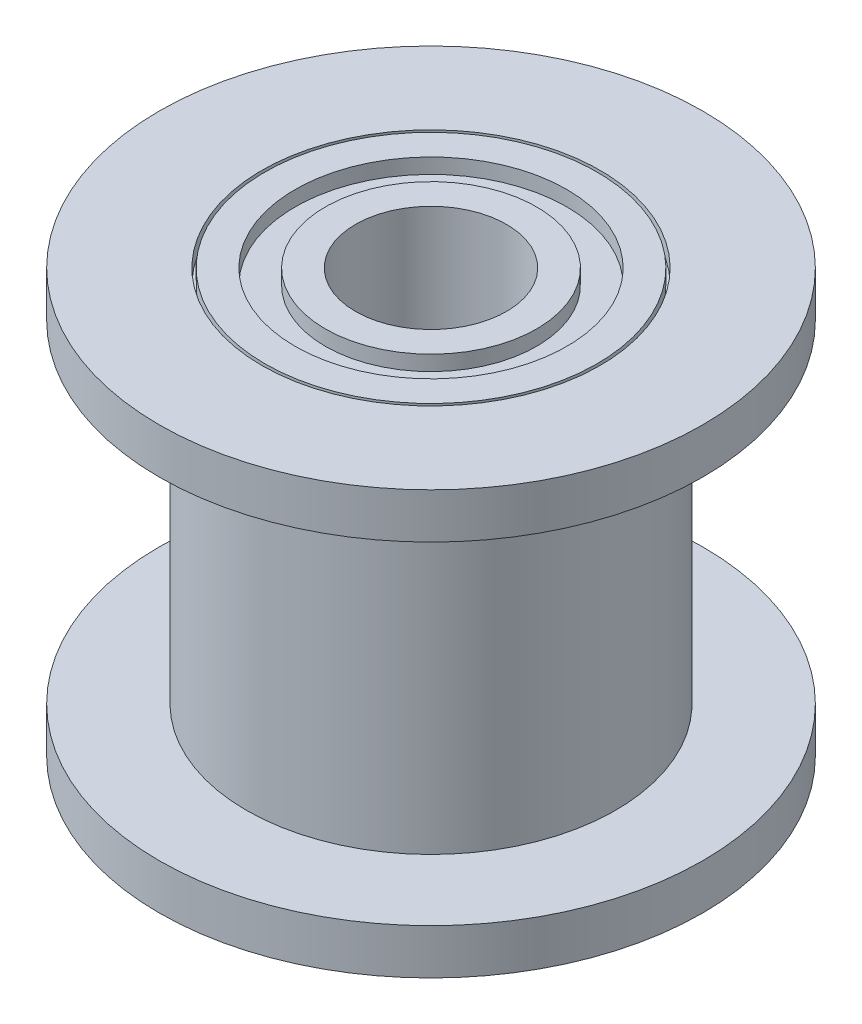
ISO-10303-21;
HEADER;
FILE_DESCRIPTION(('STEP AP214'),'2;1');
FILE_NAME('part.step','',(''),(''),'','','');
FILE_SCHEMA(('AUTOMOTIVE_DESIGN { 1 0 10303 214 1 1 1 1 }'));
ENDSEC;
DATA;
#1=APPLICATION_CONTEXT('core data for automotive mechanical design processes');
#2=APPLICATION_PROTOCOL_DEFINITION('international standard','automotive_design',2000,#1);
#3=PRODUCT_CONTEXT('',#1,'mechanical');
#4=PRODUCT('Part','Part','',(#3));
#5=PRODUCT_RELATED_PRODUCT_CATEGORY('part','',(#4));
#6=PRODUCT_DEFINITION_FORMATION('','',#4);
#7=PRODUCT_DEFINITION_CONTEXT('part definition',#1,'design');
#8=PRODUCT_DEFINITION('design','',#6,#7);
#9=PRODUCT_DEFINITION_SHAPE('','',#8);
#10=(LENGTH_UNIT() NAMED_UNIT(*) SI_UNIT(.MILLI.,.METRE.));
#11=(NAMED_UNIT(*) PLANE_ANGLE_UNIT() SI_UNIT($,.RADIAN.));
#12=(NAMED_UNIT(*) SI_UNIT($,.STERADIAN.) SOLID_ANGLE_UNIT());
#13=UNCERTAINTY_MEASURE_WITH_UNIT(LENGTH_MEASURE(1.E-05),#10,'distance_accuracy_value','');
#14=(GEOMETRIC_REPRESENTATION_CONTEXT(3) GLOBAL_UNCERTAINTY_ASSIGNED_CONTEXT((#13)) GLOBAL_UNIT_ASSIGNED_CONTEXT((#10,
#11,#12)) REPRESENTATION_CONTEXT('',''));
#15=CARTESIAN_POINT('',(0.,0.,0.));
#16=DIRECTION('',(0.,0.,1.));
#17=DIRECTION('',(1.,0.,0.));
#18=AXIS2_PLACEMENT_3D('',#15,#16,#17);
#19=CARTESIAN_POINT('',(0.,0.,0.));
#20=DIRECTION('',(0.,1.,0.));
#21=DIRECTION('',(0.,0.,1.));
#22=AXIS2_PLACEMENT_3D('',#19,#20,#21);
#23=PLANE('',#22);
#24=CARTESIAN_POINT('',(0.,0.,0.));
#25=DIRECTION('',(0.,1.,0.));
#26=DIRECTION('',(0.,0.,1.));
#27=AXIS2_PLACEMENT_3D('',#24,#25,#26);
#28=CIRCLE('',#27,2.5);
#29=CARTESIAN_POINT('',(0.,0.,2.5));
#30=VERTEX_POINT('',#29);
#31=EDGE_CURVE('E86',#30,#30,#28,.T.);
#32=ORIENTED_EDGE('',*,*,#31,.T.);
#33=EDGE_LOOP('',(#32));
#34=FACE_BOUND('',#33,.T.);
#35=CARTESIAN_POINT('',(0.,0.,0.));
#36=DIRECTION('',(0.,1.,0.));
#37=DIRECTION('',(0.,0.,1.));
#38=AXIS2_PLACEMENT_3D('',#35,#36,#37);
#39=CIRCLE('',#38,3.5);
#40=CARTESIAN_POINT('',(0.,0.,3.5));
#41=VERTEX_POINT('',#40);
#42=EDGE_CURVE('E135',#41,#41,#39,.T.);
#43=ORIENTED_EDGE('',*,*,#42,.F.);
#44=EDGE_LOOP('',(#43));
#45=FACE_BOUND('',#44,.T.);
#46=ADVANCED_FACE('F61',(#34,#45),#23,.F.);
#47=CARTESIAN_POINT('',(0.,14.,0.));
#48=DIRECTION('',(0.,-1.,0.));
#49=DIRECTION('',(0.,0.,1.));
#50=AXIS2_PLACEMENT_3D('',#47,#48,#49);
#51=PLANE('',#50);
#52=CARTESIAN_POINT('',(0.,14.,0.));
#53=DIRECTION('',(0.,1.,0.));
#54=DIRECTION('',(0.,0.,1.));
#55=AXIS2_PLACEMENT_3D('',#52,#53,#54);
#56=CIRCLE('',#55,2.5);
#57=CARTESIAN_POINT('',(0.,14.,2.5));
#58=VERTEX_POINT('',#57);
#59=EDGE_CURVE('E90',#58,#58,#56,.T.);
#60=ORIENTED_EDGE('',*,*,#59,.F.);
#61=EDGE_LOOP('',(#60));
#62=FACE_BOUND('',#61,.T.);
#63=CARTESIAN_POINT('',(0.,14.,0.));
#64=DIRECTION('',(0.,1.,0.));
#65=DIRECTION('',(0.,0.,1.));
#66=AXIS2_PLACEMENT_3D('',#63,#64,#65);
#67=CIRCLE('',#66,3.5);
#68=CARTESIAN_POINT('',(0.,14.,3.5));
#69=VERTEX_POINT('',#68);
#70=EDGE_CURVE('E103',#69,#69,#67,.T.);
#71=ORIENTED_EDGE('',*,*,#70,.T.);
#72=EDGE_LOOP('',(#71));
#73=FACE_BOUND('',#72,.T.);
#74=ADVANCED_FACE('F184',(#62,#73),#51,.F.);
#75=CARTESIAN_POINT('',(0.,1.5,0.));
#76=DIRECTION('',(0.,-1.,0.));
#77=DIRECTION('',(0.,0.,-1.));
#78=AXIS2_PLACEMENT_3D('',#75,#76,#77);
#79=CYLINDRICAL_SURFACE('',#78,9.);
#80=CARTESIAN_POINT('',(0.,1.5,0.));
#81=DIRECTION('',(0.,1.,0.));
#82=DIRECTION('',(0.,0.,1.));
#83=AXIS2_PLACEMENT_3D('',#80,#81,#82);
#84=CIRCLE('',#83,9.);
#85=CARTESIAN_POINT('',(0.,1.5,9.));
#86=VERTEX_POINT('',#85);
#87=EDGE_CURVE('E70',#86,#86,#84,.T.);
#88=ORIENTED_EDGE('',*,*,#87,.F.);
#89=EDGE_LOOP('',(#88));
#90=FACE_BOUND('',#89,.T.);
#91=CARTESIAN_POINT('',(0.,0.,0.));
#92=DIRECTION('',(0.,1.,0.));
#93=DIRECTION('',(0.,0.,1.));
#94=AXIS2_PLACEMENT_3D('',#91,#92,#93);
#95=CIRCLE('',#94,9.);
#96=CARTESIAN_POINT('',(0.,0.,9.));
#97=VERTEX_POINT('',#96);
#98=EDGE_CURVE('E65',#97,#97,#95,.T.);
#99=ORIENTED_EDGE('',*,*,#98,.T.);
#100=EDGE_LOOP('',(#99));
#101=FACE_BOUND('',#100,.T.);
#102=ADVANCED_FACE('F63',(#90,#101),#79,.T.);
#103=CARTESIAN_POINT('',(0.,1.5,0.));
#104=DIRECTION('',(0.,1.,0.));
#105=DIRECTION('',(0.,0.,1.));
#106=AXIS2_PLACEMENT_3D('',#103,#104,#105);
#107=PLANE('',#106);
#108=CARTESIAN_POINT('',(0.,1.5,0.));
#109=DIRECTION('',(0.,1.,0.));
#110=DIRECTION('',(0.,0.,1.));
#111=AXIS2_PLACEMENT_3D('',#108,#109,#110);
#112=CIRCLE('',#111,6.1121977);
#113=CARTESIAN_POINT('',(0.,1.5,6.1121977));
#114=VERTEX_POINT('',#113);
#115=EDGE_CURVE('E11',#114,#114,#112,.T.);
#116=ORIENTED_EDGE('',*,*,#115,.F.);
#117=EDGE_LOOP('',(#116));
#118=FACE_BOUND('',#117,.T.);
#119=ORIENTED_EDGE('',*,*,#87,.T.);
#120=EDGE_LOOP('',(#119));
#121=FACE_BOUND('',#120,.T.);
#122=ADVANCED_FACE('F188',(#118,#121),#107,.T.);
#123=CARTESIAN_POINT('',(0.,0.,0.));
#124=DIRECTION('',(0.,1.,0.));
#125=DIRECTION('',(0.,0.,1.));
#126=AXIS2_PLACEMENT_3D('',#123,#124,#125);
#127=CIRCLE('',#126,5.6);
#128=CARTESIAN_POINT('',(0.,0.,5.6));
#129=VERTEX_POINT('',#128);
#130=EDGE_CURVE('E146',#129,#129,#127,.T.);
#131=ORIENTED_EDGE('',*,*,#130,.T.);
#132=EDGE_LOOP('',(#131));
#133=FACE_BOUND('',#132,.T.);
#134=ORIENTED_EDGE('',*,*,#98,.F.);
#135=EDGE_LOOP('',(#134));
#136=FACE_BOUND('',#135,.T.);
#137=ADVANCED_FACE('F176',(#133,#136),#23,.F.);
#138=CARTESIAN_POINT('',(0.,7.,0.));
#139=DIRECTION('',(0.,-1.,0.));
#140=DIRECTION('',(0.,0.,-1.));
#141=AXIS2_PLACEMENT_3D('',#138,#139,#140);
#142=CYLINDRICAL_SURFACE('',#141,6.1121977);
#143=ORIENTED_EDGE('',*,*,#115,.T.);
#144=EDGE_LOOP('',(#143));
#145=FACE_BOUND('',#144,.T.);
#146=CARTESIAN_POINT('',(0.,12.5,0.));
#147=DIRECTION('',(0.,1.,0.));
#148=DIRECTION('',(0.,0.,1.));
#149=AXIS2_PLACEMENT_3D('',#146,#147,#148);
#150=CIRCLE('',#149,6.1121977);
#151=CARTESIAN_POINT('',(0.,12.5,6.1121977));
#152=VERTEX_POINT('',#151);
#153=EDGE_CURVE('E77',#152,#152,#150,.T.);
#154=ORIENTED_EDGE('',*,*,#153,.F.);
#155=EDGE_LOOP('',(#154));
#156=FACE_BOUND('',#155,.T.);
#157=ADVANCED_FACE('F187',(#145,#156),#142,.T.);
#158=CARTESIAN_POINT('',(0.,12.5,0.));
#159=DIRECTION('',(0.,1.,0.));
#160=DIRECTION('',(0.,0.,1.));
#161=AXIS2_PLACEMENT_3D('',#158,#159,#160);
#162=CYLINDRICAL_SURFACE('',#161,9.);
#163=CARTESIAN_POINT('',(0.,12.5,0.));
#164=DIRECTION('',(0.,1.,0.));
#165=DIRECTION('',(0.,0.,1.));
#166=AXIS2_PLACEMENT_3D('',#163,#164,#165);
#167=CIRCLE('',#166,9.);
#168=CARTESIAN_POINT('',(0.,12.5,9.));
#169=VERTEX_POINT('',#168);
#170=EDGE_CURVE('E81',#169,#169,#167,.T.);
#171=ORIENTED_EDGE('',*,*,#170,.T.);
#172=EDGE_LOOP('',(#171));
#173=FACE_BOUND('',#172,.T.);
#174=CARTESIAN_POINT('',(0.,14.,0.));
#175=DIRECTION('',(0.,1.,0.));
#176=DIRECTION('',(0.,0.,1.));
#177=AXIS2_PLACEMENT_3D('',#174,#175,#176);
#178=CIRCLE('',#177,9.);
#179=CARTESIAN_POINT('',(0.,14.,9.));
#180=VERTEX_POINT('',#179);
#181=EDGE_CURVE('E82',#180,#180,#178,.T.);
#182=ORIENTED_EDGE('',*,*,#181,.F.);
#183=EDGE_LOOP('',(#182));
#184=FACE_BOUND('',#183,.T.);
#185=ADVANCED_FACE('F194',(#173,#184),#162,.T.);
#186=CARTESIAN_POINT('',(0.,12.5,0.));
#187=DIRECTION('',(0.,-1.,0.));
#188=DIRECTION('',(0.,0.,1.));
#189=AXIS2_PLACEMENT_3D('',#186,#187,#188);
#190=PLANE('',#189);
#191=ORIENTED_EDGE('',*,*,#153,.T.);
#192=EDGE_LOOP('',(#191));
#193=FACE_BOUND('',#192,.T.);
#194=ORIENTED_EDGE('',*,*,#170,.F.);
#195=EDGE_LOOP('',(#194));
#196=FACE_BOUND('',#195,.T.);
#197=ADVANCED_FACE('F224',(#193,#196),#190,.T.);
#198=CARTESIAN_POINT('',(0.,14.,0.));
#199=DIRECTION('',(0.,1.,0.));
#200=DIRECTION('',(0.,0.,1.));
#201=AXIS2_PLACEMENT_3D('',#198,#199,#200);
#202=CIRCLE('',#201,5.6);
#203=CARTESIAN_POINT('',(0.,14.,5.6));
#204=VERTEX_POINT('',#203);
#205=EDGE_CURVE('E114',#204,#204,#202,.T.);
#206=ORIENTED_EDGE('',*,*,#205,.F.);
#207=EDGE_LOOP('',(#206));
#208=FACE_BOUND('',#207,.T.);
#209=ORIENTED_EDGE('',*,*,#181,.T.);
#210=EDGE_LOOP('',(#209));
#211=FACE_BOUND('',#210,.T.);
#212=ADVANCED_FACE('F211',(#208,#211),#51,.F.);
#213=CARTESIAN_POINT('',(0.,0.,0.));
#214=DIRECTION('',(0.,1.,0.));
#215=DIRECTION('',(0.,0.,1.));
#216=AXIS2_PLACEMENT_3D('',#213,#214,#215);
#217=CYLINDRICAL_SURFACE('',#216,2.5);
#218=CARTESIAN_POINT('',(0.,0.,2.5));
#219=CARTESIAN_POINT('',(0.,0.145833333333333,2.5));
#220=CARTESIAN_POINT('',(0.,0.291666666666667,2.5));
#221=CARTESIAN_POINT('',(0.,0.583333333333333,2.5));
#222=CARTESIAN_POINT('',(0.,0.729166666666667,2.5));
#223=CARTESIAN_POINT('',(0.,1.02083333333333,2.5));
#224=CARTESIAN_POINT('',(0.,1.16666666666667,2.5));
#225=CARTESIAN_POINT('',(0.,1.45833333333333,2.5));
#226=CARTESIAN_POINT('',(0.,1.60416666666667,2.5));
#227=CARTESIAN_POINT('',(0.,1.89583333333333,2.5));
#228=CARTESIAN_POINT('',(0.,2.04166666666667,2.5));
#229=CARTESIAN_POINT('',(0.,2.33333333333333,2.5));
#230=CARTESIAN_POINT('',(0.,2.47916666666667,2.5));
#231=CARTESIAN_POINT('',(0.,2.77083333333333,2.5));
#232=CARTESIAN_POINT('',(0.,2.91666666666667,2.5));
#233=CARTESIAN_POINT('',(0.,3.20833333333333,2.5));
#234=CARTESIAN_POINT('',(0.,3.35416666666667,2.5));
#235=CARTESIAN_POINT('',(0.,3.64583333333333,2.5));
#236=CARTESIAN_POINT('',(0.,3.79166666666667,2.5));
#237=CARTESIAN_POINT('',(0.,4.08333333333333,2.5));
#238=CARTESIAN_POINT('',(0.,4.22916666666667,2.5));
#239=CARTESIAN_POINT('',(0.,4.52083333333333,2.5));
#240=CARTESIAN_POINT('',(0.,4.66666666666667,2.5));
#241=CARTESIAN_POINT('',(0.,4.95833333333333,2.5));
#242=CARTESIAN_POINT('',(0.,5.10416666666667,2.5));
#243=CARTESIAN_POINT('',(0.,5.39583333333333,2.5));
#244=CARTESIAN_POINT('',(0.,5.54166666666667,2.5));
#245=CARTESIAN_POINT('',(0.,5.83333333333333,2.5));
#246=CARTESIAN_POINT('',(0.,5.97916666666667,2.5));
#247=CARTESIAN_POINT('',(0.,6.27083333333333,2.5));
#248=CARTESIAN_POINT('',(0.,6.41666666666667,2.5));
#249=CARTESIAN_POINT('',(0.,6.70833333333333,2.5));
#250=CARTESIAN_POINT('',(0.,6.85416666666666,2.5));
#251=CARTESIAN_POINT('',(0.,7.14583333333333,2.5));
#252=CARTESIAN_POINT('',(0.,7.29166666666667,2.5));
#253=CARTESIAN_POINT('',(0.,7.58333333333333,2.5));
#254=CARTESIAN_POINT('',(0.,7.72916666666667,2.5));
#255=CARTESIAN_POINT('',(0.,8.02083333333333,2.5));
#256=CARTESIAN_POINT('',(0.,8.16666666666666,2.5));
#257=CARTESIAN_POINT('',(0.,8.45833333333333,2.5));
#258=CARTESIAN_POINT('',(0.,8.60416666666666,2.5));
#259=CARTESIAN_POINT('',(0.,8.89583333333333,2.5));
#260=CARTESIAN_POINT('',(0.,9.04166666666666,2.5));
#261=CARTESIAN_POINT('',(0.,9.33333333333333,2.5));
#262=CARTESIAN_POINT('',(0.,9.47916666666666,2.5));
#263=CARTESIAN_POINT('',(0.,9.77083333333333,2.5));
#264=CARTESIAN_POINT('',(0.,9.91666666666666,2.5));
#265=CARTESIAN_POINT('',(0.,10.2083333333333,2.5));
#266=CARTESIAN_POINT('',(0.,10.3541666666667,2.5));
#267=CARTESIAN_POINT('',(0.,10.6458333333333,2.5));
#268=CARTESIAN_POINT('',(0.,10.7916666666667,2.5));
#269=CARTESIAN_POINT('',(0.,11.0833333333333,2.5));
#270=CARTESIAN_POINT('',(0.,11.2291666666667,2.5));
#271=CARTESIAN_POINT('',(0.,11.5208333333333,2.5));
#272=CARTESIAN_POINT('',(0.,11.6666666666667,2.5));
#273=CARTESIAN_POINT('',(0.,11.9583333333333,2.5));
#274=CARTESIAN_POINT('',(0.,12.1041666666667,2.5));
#275=CARTESIAN_POINT('',(0.,12.3958333333333,2.5));
#276=CARTESIAN_POINT('',(0.,12.5416666666667,2.5));
#277=CARTESIAN_POINT('',(0.,12.8333333333333,2.5));
#278=CARTESIAN_POINT('',(0.,12.9791666666667,2.5));
#279=CARTESIAN_POINT('',(0.,13.2708333333333,2.5));
#280=CARTESIAN_POINT('',(0.,13.4166666666667,2.5));
#281=CARTESIAN_POINT('',(0.,13.7083333333333,2.5));
#282=CARTESIAN_POINT('',(0.,13.8541666666667,2.5));
#283=CARTESIAN_POINT('',(0.,14.,2.5));
#284=B_SPLINE_CURVE_WITH_KNOTS('',3,(#218,#219,#220,#221,#222,#223,#224,#225,#226,#227,#228,
#229,#230,#231,#232,#233,#234,#235,#236,#237,#238,#239,#240,#241,#242,#243,#244,#245,#246,#247,
#248,#249,#250,#251,#252,#253,#254,#255,#256,#257,#258,#259,#260,#261,#262,#263,#264,#265,#266,
#267,#268,#269,#270,#271,#272,#273,#274,#275,#276,#277,#278,#279,#280,#281,#282,#283),
.UNSPECIFIED.,.F.,.F.,(4,2,2,2,2,2,2,2,2,2,2,2,2,2,2,2,2,2,2,2,2,2,2,2,2,2,2,2,2,2,2,2,4),(0.,
0.4375,0.875,1.3125,1.75,2.1875,2.625,3.0625,3.5,3.9375,4.375,4.8125,5.25,5.6875,6.125,6.5625,
7.,7.4375,7.875,8.3125,8.75,9.1875,9.625,10.0625,10.5,10.9375,11.375,11.8125,12.25,12.6875,
13.125,13.5625,14.),.UNSPECIFIED.);
#285=EDGE_CURVE('BSEAM223',#30,#58,#284,.T.);
#286=ORIENTED_EDGE('',*,*,#31,.F.);
#287=ORIENTED_EDGE('',*,*,#59,.T.);
#288=ORIENTED_EDGE('',*,*,#285,.T.);
#289=ORIENTED_EDGE('',*,*,#285,.F.);
#290=EDGE_LOOP('',(#286,#288,#287,#289));
#291=FACE_BOUND('',#290,.T.);
#292=ADVANCED_FACE('F223',(#291),#217,.F.);
#293=CARTESIAN_POINT('',(0.,13.5,0.));
#294=DIRECTION('',(0.,1.,0.));
#295=DIRECTION('',(0.,0.,1.));
#296=AXIS2_PLACEMENT_3D('',#293,#294,#295);
#297=CYLINDRICAL_SURFACE('',#296,3.5);
#298=CARTESIAN_POINT('',(0.,13.5,0.));
#299=DIRECTION('',(0.,1.,0.));
#300=DIRECTION('',(0.,0.,1.));
#301=AXIS2_PLACEMENT_3D('',#298,#299,#300);
#302=CIRCLE('',#301,3.5);
#303=CARTESIAN_POINT('',(0.,13.5,3.5));
#304=VERTEX_POINT('',#303);
#305=EDGE_CURVE('E102',#304,#304,#302,.T.);
#306=ORIENTED_EDGE('',*,*,#305,.T.);
#307=EDGE_LOOP('',(#306));
#308=FACE_BOUND('',#307,.T.);
#309=ORIENTED_EDGE('',*,*,#70,.F.);
#310=EDGE_LOOP('',(#309));
#311=FACE_BOUND('',#310,.T.);
#312=ADVANCED_FACE('F262',(#308,#311),#297,.T.);
#313=CARTESIAN_POINT('',(0.,13.5,0.));
#314=DIRECTION('',(0.,1.,0.));
#315=DIRECTION('',(0.,0.,1.));
#316=AXIS2_PLACEMENT_3D('',#313,#314,#315);
#317=CYLINDRICAL_SURFACE('',#316,4.5);
#318=CARTESIAN_POINT('',(0.,13.5,0.));
#319=DIRECTION('',(0.,1.,0.));
#320=DIRECTION('',(0.,0.,1.));
#321=AXIS2_PLACEMENT_3D('',#318,#319,#320);
#322=CIRCLE('',#321,4.5);
#323=CARTESIAN_POINT('',(0.,13.5,4.5));
#324=VERTEX_POINT('',#323);
#325=EDGE_CURVE('E94',#324,#324,#322,.T.);
#326=ORIENTED_EDGE('',*,*,#325,.F.);
#327=EDGE_LOOP('',(#326));
#328=FACE_BOUND('',#327,.T.);
#329=CARTESIAN_POINT('',(0.,14.,0.));
#330=DIRECTION('',(0.,1.,0.));
#331=DIRECTION('',(0.,0.,1.));
#332=AXIS2_PLACEMENT_3D('',#329,#330,#331);
#333=CIRCLE('',#332,4.5);
#334=CARTESIAN_POINT('',(0.,14.,4.5));
#335=VERTEX_POINT('',#334);
#336=EDGE_CURVE('E98',#335,#335,#333,.T.);
#337=ORIENTED_EDGE('',*,*,#336,.T.);
#338=EDGE_LOOP('',(#337));
#339=FACE_BOUND('',#338,.T.);
#340=ADVANCED_FACE('F256',(#328,#339),#317,.F.);
#341=CARTESIAN_POINT('',(0.,13.5,0.));
#342=DIRECTION('',(0.,1.,0.));
#343=DIRECTION('',(0.,0.,1.));
#344=AXIS2_PLACEMENT_3D('',#341,#342,#343);
#345=PLANE('',#344);
#346=ORIENTED_EDGE('',*,*,#305,.F.);
#347=EDGE_LOOP('',(#346));
#348=FACE_BOUND('',#347,.T.);
#349=ORIENTED_EDGE('',*,*,#325,.T.);
#350=EDGE_LOOP('',(#349));
#351=FACE_BOUND('',#350,.T.);
#352=ADVANCED_FACE('F247',(#348,#351),#345,.T.);
#353=CARTESIAN_POINT('',(0.,13.5,0.));
#354=DIRECTION('',(0.,1.,0.));
#355=DIRECTION('',(0.,0.,1.));
#356=AXIS2_PLACEMENT_3D('',#353,#354,#355);
#357=CYLINDRICAL_SURFACE('',#356,5.5);
#358=CARTESIAN_POINT('',(0.,13.5,0.));
#359=DIRECTION('',(0.,1.,0.));
#360=DIRECTION('',(0.,0.,1.));
#361=AXIS2_PLACEMENT_3D('',#358,#359,#360);
#362=CIRCLE('',#361,5.5);
#363=CARTESIAN_POINT('',(0.,13.5,5.5));
#364=VERTEX_POINT('',#363);
#365=EDGE_CURVE('E118',#364,#364,#362,.T.);
#366=ORIENTED_EDGE('',*,*,#365,.T.);
#367=EDGE_LOOP('',(#366));
#368=FACE_BOUND('',#367,.T.);
#369=CARTESIAN_POINT('',(0.,14.,0.));
#370=DIRECTION('',(0.,1.,0.));
#371=DIRECTION('',(0.,0.,1.));
#372=AXIS2_PLACEMENT_3D('',#369,#370,#371);
#373=CIRCLE('',#372,5.5);
#374=CARTESIAN_POINT('',(0.,14.,5.5));
#375=VERTEX_POINT('',#374);
#376=EDGE_CURVE('E119',#375,#375,#373,.T.);
#377=ORIENTED_EDGE('',*,*,#376,.F.);
#378=EDGE_LOOP('',(#377));
#379=FACE_BOUND('',#378,.T.);
#380=ADVANCED_FACE('F245',(#368,#379),#357,.T.);
#381=CARTESIAN_POINT('',(0.,13.5,0.));
#382=DIRECTION('',(0.,1.,0.));
#383=DIRECTION('',(0.,0.,1.));
#384=AXIS2_PLACEMENT_3D('',#381,#382,#383);
#385=CYLINDRICAL_SURFACE('',#384,5.6);
#386=CARTESIAN_POINT('',(0.,13.5,0.));
#387=DIRECTION('',(0.,1.,0.));
#388=DIRECTION('',(0.,0.,1.));
#389=AXIS2_PLACEMENT_3D('',#386,#387,#388);
#390=CIRCLE('',#389,5.6);
#391=CARTESIAN_POINT('',(0.,13.5,5.6));
#392=VERTEX_POINT('',#391);
#393=EDGE_CURVE('E107',#392,#392,#390,.T.);
#394=ORIENTED_EDGE('',*,*,#393,.F.);
#395=EDGE_LOOP('',(#394));
#396=FACE_BOUND('',#395,.T.);
#397=ORIENTED_EDGE('',*,*,#205,.T.);
#398=EDGE_LOOP('',(#397));
#399=FACE_BOUND('',#398,.T.);
#400=ADVANCED_FACE('F238',(#396,#399),#385,.F.);
#401=CARTESIAN_POINT('',(0.,13.5,0.));
#402=DIRECTION('',(0.,1.,0.));
#403=DIRECTION('',(0.,0.,1.));
#404=AXIS2_PLACEMENT_3D('',#401,#402,#403);
#405=PLANE('',#404);
#406=ORIENTED_EDGE('',*,*,#365,.F.);
#407=EDGE_LOOP('',(#406));
#408=FACE_BOUND('',#407,.T.);
#409=ORIENTED_EDGE('',*,*,#393,.T.);
#410=EDGE_LOOP('',(#409));
#411=FACE_BOUND('',#410,.T.);
#412=ADVANCED_FACE('F228',(#408,#411),#405,.T.);
#413=ORIENTED_EDGE('',*,*,#336,.F.);
#414=EDGE_LOOP('',(#413));
#415=FACE_BOUND('',#414,.T.);
#416=ORIENTED_EDGE('',*,*,#376,.T.);
#417=EDGE_LOOP('',(#416));
#418=FACE_BOUND('',#417,.T.);
#419=ADVANCED_FACE('F212',(#415,#418),#51,.F.);
#420=CARTESIAN_POINT('',(0.,0.5,0.));
#421=DIRECTION('',(0.,-1.,0.));
#422=DIRECTION('',(0.,0.,-1.));
#423=AXIS2_PLACEMENT_3D('',#420,#421,#422);
#424=CYLINDRICAL_SURFACE('',#423,3.5);
#425=CARTESIAN_POINT('',(0.,0.5,0.));
#426=DIRECTION('',(0.,1.,0.));
#427=DIRECTION('',(0.,0.,1.));
#428=AXIS2_PLACEMENT_3D('',#425,#426,#427);
#429=CIRCLE('',#428,3.5);
#430=CARTESIAN_POINT('',(0.,0.5,3.5));
#431=VERTEX_POINT('',#430);
#432=EDGE_CURVE('E134',#431,#431,#429,.T.);
#433=ORIENTED_EDGE('',*,*,#432,.F.);
#434=EDGE_LOOP('',(#433));
#435=FACE_BOUND('',#434,.T.);
#436=ORIENTED_EDGE('',*,*,#42,.T.);
#437=EDGE_LOOP('',(#436));
#438=FACE_BOUND('',#437,.T.);
#439=ADVANCED_FACE('F227',(#435,#438),#424,.T.);
#440=CARTESIAN_POINT('',(0.,0.5,0.));
#441=DIRECTION('',(0.,-1.,0.));
#442=DIRECTION('',(0.,0.,-1.));
#443=AXIS2_PLACEMENT_3D('',#440,#441,#442);
#444=CYLINDRICAL_SURFACE('',#443,4.5);
#445=CARTESIAN_POINT('',(0.,0.5,0.));
#446=DIRECTION('',(0.,1.,0.));
#447=DIRECTION('',(0.,0.,1.));
#448=AXIS2_PLACEMENT_3D('',#445,#446,#447);
#449=CIRCLE('',#448,4.5);
#450=CARTESIAN_POINT('',(0.,0.5,4.5));
#451=VERTEX_POINT('',#450);
#452=EDGE_CURVE('E123',#451,#451,#449,.T.);
#453=ORIENTED_EDGE('',*,*,#452,.T.);
#454=EDGE_LOOP('',(#453));
#455=FACE_BOUND('',#454,.T.);
#456=CARTESIAN_POINT('',(0.,0.,0.));
#457=DIRECTION('',(0.,1.,0.));
#458=DIRECTION('',(0.,0.,1.));
#459=AXIS2_PLACEMENT_3D('',#456,#457,#458);
#460=CIRCLE('',#459,4.5);
#461=CARTESIAN_POINT('',(0.,0.,4.5));
#462=VERTEX_POINT('',#461);
#463=EDGE_CURVE('E130',#462,#462,#460,.T.);
#464=ORIENTED_EDGE('',*,*,#463,.F.);
#465=EDGE_LOOP('',(#464));
#466=FACE_BOUND('',#465,.T.);
#467=ADVANCED_FACE('F234',(#455,#466),#444,.F.);
#468=CARTESIAN_POINT('',(0.,0.5,0.));
#469=DIRECTION('',(0.,-1.,0.));
#470=DIRECTION('',(0.,0.,1.));
#471=AXIS2_PLACEMENT_3D('',#468,#469,#470);
#472=PLANE('',#471);
#473=ORIENTED_EDGE('',*,*,#432,.T.);
#474=EDGE_LOOP('',(#473));
#475=FACE_BOUND('',#474,.T.);
#476=ORIENTED_EDGE('',*,*,#452,.F.);
#477=EDGE_LOOP('',(#476));
#478=FACE_BOUND('',#477,.T.);
#479=ADVANCED_FACE('F169',(#475,#478),#472,.T.);
#480=CARTESIAN_POINT('',(0.,0.5,0.));
#481=DIRECTION('',(0.,-1.,0.));
#482=DIRECTION('',(0.,0.,-1.));
#483=AXIS2_PLACEMENT_3D('',#480,#481,#482);
#484=CYLINDRICAL_SURFACE('',#483,5.5);
#485=CARTESIAN_POINT('',(0.,0.5,0.));
#486=DIRECTION('',(0.,1.,0.));
#487=DIRECTION('',(0.,0.,1.));
#488=AXIS2_PLACEMENT_3D('',#485,#486,#487);
#489=CIRCLE('',#488,5.5);
#490=CARTESIAN_POINT('',(0.,0.5,5.5));
#491=VERTEX_POINT('',#490);
#492=EDGE_CURVE('E150',#491,#491,#489,.T.);
#493=ORIENTED_EDGE('',*,*,#492,.F.);
#494=EDGE_LOOP('',(#493));
#495=FACE_BOUND('',#494,.T.);
#496=CARTESIAN_POINT('',(0.,0.,0.));
#497=DIRECTION('',(0.,1.,0.));
#498=DIRECTION('',(0.,0.,1.));
#499=AXIS2_PLACEMENT_3D('',#496,#497,#498);
#500=CIRCLE('',#499,5.5);
#501=CARTESIAN_POINT('',(0.,0.,5.5));
#502=VERTEX_POINT('',#501);
#503=EDGE_CURVE('E151',#502,#502,#500,.T.);
#504=ORIENTED_EDGE('',*,*,#503,.T.);
#505=EDGE_LOOP('',(#504));
#506=FACE_BOUND('',#505,.T.);
#507=ADVANCED_FACE('F165',(#495,#506),#484,.T.);
#508=CARTESIAN_POINT('',(0.,0.5,0.));
#509=DIRECTION('',(0.,-1.,0.));
#510=DIRECTION('',(0.,0.,-1.));
#511=AXIS2_PLACEMENT_3D('',#508,#509,#510);
#512=CYLINDRICAL_SURFACE('',#511,5.6);
#513=CARTESIAN_POINT('',(0.,0.5,0.));
#514=DIRECTION('',(0.,1.,0.));
#515=DIRECTION('',(0.,0.,1.));
#516=AXIS2_PLACEMENT_3D('',#513,#514,#515);
#517=CIRCLE('',#516,5.6);
#518=CARTESIAN_POINT('',(0.,0.5,5.6));
#519=VERTEX_POINT('',#518);
#520=EDGE_CURVE('E139',#519,#519,#517,.T.);
#521=ORIENTED_EDGE('',*,*,#520,.T.);
#522=EDGE_LOOP('',(#521));
#523=FACE_BOUND('',#522,.T.);
#524=ORIENTED_EDGE('',*,*,#130,.F.);
#525=EDGE_LOOP('',(#524));
#526=FACE_BOUND('',#525,.T.);
#527=ADVANCED_FACE('F168',(#523,#526),#512,.F.);
#528=CARTESIAN_POINT('',(0.,0.5,0.));
#529=DIRECTION('',(0.,-1.,0.));
#530=DIRECTION('',(0.,0.,1.));
#531=AXIS2_PLACEMENT_3D('',#528,#529,#530);
#532=PLANE('',#531);
#533=ORIENTED_EDGE('',*,*,#492,.T.);
#534=EDGE_LOOP('',(#533));
#535=FACE_BOUND('',#534,.T.);
#536=ORIENTED_EDGE('',*,*,#520,.F.);
#537=EDGE_LOOP('',(#536));
#538=FACE_BOUND('',#537,.T.);
#539=ADVANCED_FACE('F162',(#535,#538),#532,.T.);
#540=ORIENTED_EDGE('',*,*,#463,.T.);
#541=EDGE_LOOP('',(#540));
#542=FACE_BOUND('',#541,.T.);
#543=ORIENTED_EDGE('',*,*,#503,.F.);
#544=EDGE_LOOP('',(#543));
#545=FACE_BOUND('',#544,.T.);
#546=ADVANCED_FACE('F173',(#542,#545),#23,.F.);
#547=CLOSED_SHELL('',(#46,#74,#102,#122,#137,#157,#185,#197,#212,#292,#312,#340,#352,#380,#400,
#412,#419,#439,#467,#479,#507,#527,#539,#546));
#548=MANIFOLD_SOLID_BREP('B2',#547);
#549=ADVANCED_BREP_SHAPE_REPRESENTATION('',(#18,#548),#14);
#550=SHAPE_DEFINITION_REPRESENTATION(#9,#549);
ENDSEC;
END-ISO-10303-21;
